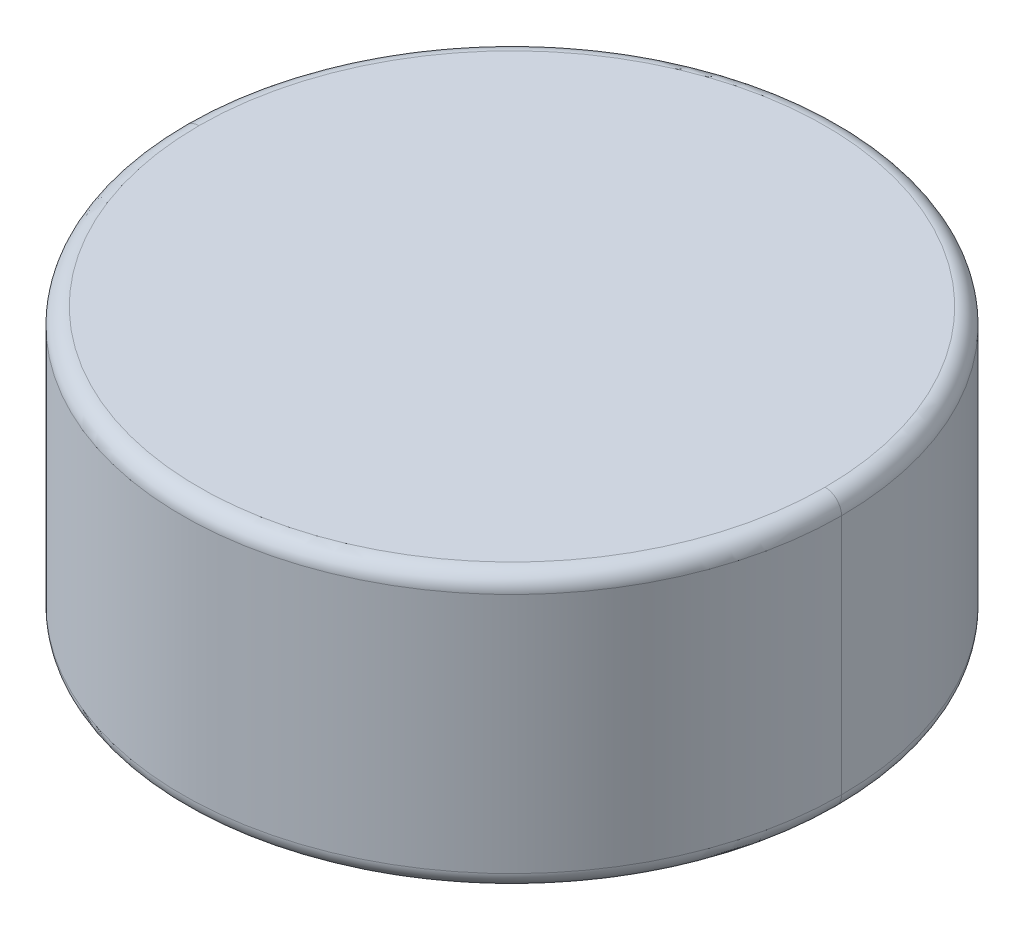
ISO-10303-21;
HEADER;
FILE_DESCRIPTION(('STEP AP214'),'2;1');
FILE_NAME('part.step','',(''),(''),'','','');
FILE_SCHEMA(('AUTOMOTIVE_DESIGN { 1 0 10303 214 1 1 1 1 }'));
ENDSEC;
DATA;
#1=APPLICATION_CONTEXT('core data for automotive mechanical design processes');
#2=APPLICATION_PROTOCOL_DEFINITION('international standard','automotive_design',2000,#1);
#3=PRODUCT_CONTEXT('',#1,'mechanical');
#4=PRODUCT('Part','Part','',(#3));
#5=PRODUCT_RELATED_PRODUCT_CATEGORY('part','',(#4));
#6=PRODUCT_DEFINITION_FORMATION('','',#4);
#7=PRODUCT_DEFINITION_CONTEXT('part definition',#1,'design');
#8=PRODUCT_DEFINITION('design','',#6,#7);
#9=PRODUCT_DEFINITION_SHAPE('','',#8);
#10=(LENGTH_UNIT() NAMED_UNIT(*) SI_UNIT(.MILLI.,.METRE.));
#11=(NAMED_UNIT(*) PLANE_ANGLE_UNIT() SI_UNIT($,.RADIAN.));
#12=(NAMED_UNIT(*) SI_UNIT($,.STERADIAN.) SOLID_ANGLE_UNIT());
#13=UNCERTAINTY_MEASURE_WITH_UNIT(LENGTH_MEASURE(1.E-05),#10,'distance_accuracy_value','');
#14=(GEOMETRIC_REPRESENTATION_CONTEXT(3) GLOBAL_UNCERTAINTY_ASSIGNED_CONTEXT((#13)) GLOBAL_UNIT_ASSIGNED_CONTEXT((#10,
#11,#12)) REPRESENTATION_CONTEXT('',''));
#15=CARTESIAN_POINT('',(0.,0.,0.));
#16=DIRECTION('',(0.,0.,1.));
#17=DIRECTION('',(1.,0.,0.));
#18=AXIS2_PLACEMENT_3D('',#15,#16,#17);
#19=CARTESIAN_POINT('',(0.,0.,0.));
#20=DIRECTION('',(0.,1.,0.));
#21=DIRECTION('',(1.,0.,0.));
#22=AXIS2_PLACEMENT_3D('',#19,#20,#21);
#23=CYLINDRICAL_SURFACE('',#22,3.);
#24=DIRECTION('',(0.,1.,0.));
#25=VECTOR('',#24,1.);
#26=CARTESIAN_POINT('',(3.,0.15,0.));
#27=LINE('',#26,#25);
#28=CARTESIAN_POINT('',(3.,0.15,0.));
#29=VERTEX_POINT('',#28);
#30=CARTESIAN_POINT('',(3.,2.35,0.));
#31=VERTEX_POINT('',#30);
#32=EDGE_CURVE('E42',#29,#31,#27,.T.);
#33=ORIENTED_EDGE('',*,*,#32,.F.);
#34=CARTESIAN_POINT('',(0.,0.15,0.));
#35=DIRECTION('',(0.,1.,0.));
#36=DIRECTION('',(0.999063862785748,0.,-0.0432596587552421));
#37=AXIS2_PLACEMENT_3D('',#34,#35,#36);
#38=CIRCLE('',#37,3.);
#39=CARTESIAN_POINT('',(-3.,0.15,7.518152767005E-12));
#40=VERTEX_POINT('',#39);
#41=EDGE_CURVE('E11',#29,#40,#38,.T.);
#42=ORIENTED_EDGE('',*,*,#41,.T.);
#43=DIRECTION('',(0.,1.,0.));
#44=VECTOR('',#43,1.);
#45=CARTESIAN_POINT('',(-3.,0.15,3.759156364451E-12));
#46=LINE('',#45,#44);
#47=CARTESIAN_POINT('',(-3.,2.35,7.517639288857E-12));
#48=VERTEX_POINT('',#47);
#49=EDGE_CURVE('E28',#40,#48,#46,.T.);
#50=ORIENTED_EDGE('',*,*,#49,.T.);
#51=CARTESIAN_POINT('',(0.,2.35,0.));
#52=DIRECTION('',(0.,-1.,0.));
#53=DIRECTION('',(-0.999536064934297,0.,-0.0304574275942799));
#54=AXIS2_PLACEMENT_3D('',#51,#52,#53);
#55=CIRCLE('',#54,3.);
#56=EDGE_CURVE('E115',#48,#31,#55,.T.);
#57=ORIENTED_EDGE('',*,*,#56,.T.);
#58=EDGE_LOOP('',(#33,#42,#50,#57));
#59=FACE_BOUND('',#58,.T.);
#60=ADVANCED_FACE('F17',(#59),#23,.T.);
#61=CARTESIAN_POINT('',(0.,2.35,0.));
#62=DIRECTION('',(0.,1.,0.));
#63=DIRECTION('',(0.999536064934297,0.,0.0304574275942799));
#64=AXIS2_PLACEMENT_3D('',#61,#62,#63);
#65=TOROIDAL_SURFACE('',#64,2.85,0.15);
#66=CARTESIAN_POINT('',(2.85,2.35,0.));
#67=DIRECTION('',(0.,0.,-1.));
#68=DIRECTION('',(0.,1.,0.));
#69=AXIS2_PLACEMENT_3D('',#66,#67,#68);
#70=CIRCLE('',#69,0.15);
#71=CARTESIAN_POINT('',(2.85,2.5,0.));
#72=VERTEX_POINT('',#71);
#73=EDGE_CURVE('E112',#72,#31,#70,.T.);
#74=ORIENTED_EDGE('',*,*,#73,.T.);
#75=ORIENTED_EDGE('',*,*,#56,.F.);
#76=CARTESIAN_POINT('',(-2.85,2.35,0.));
#77=DIRECTION('',(0.,0.,1.));
#78=DIRECTION('',(0.,1.,0.));
#79=AXIS2_PLACEMENT_3D('',#76,#77,#78);
#80=CIRCLE('',#79,0.15);
#81=CARTESIAN_POINT('',(-2.85,2.5,0.));
#82=VERTEX_POINT('',#81);
#83=EDGE_CURVE('E61',#82,#48,#80,.T.);
#84=ORIENTED_EDGE('',*,*,#83,.F.);
#85=CARTESIAN_POINT('',(0.,2.5,0.));
#86=DIRECTION('',(0.,-1.,0.));
#87=DIRECTION('',(-0.999536064934297,0.,-0.0304574275942799));
#88=AXIS2_PLACEMENT_3D('',#85,#86,#87);
#89=CIRCLE('',#88,2.85);
#90=EDGE_CURVE('E69',#82,#72,#89,.T.);
#91=ORIENTED_EDGE('',*,*,#90,.T.);
#92=EDGE_LOOP('',(#74,#75,#84,#91));
#93=FACE_BOUND('',#92,.T.);
#94=ADVANCED_FACE('F135',(#93),#65,.T.);
#95=CARTESIAN_POINT('',(0.,2.5,0.));
#96=DIRECTION('',(0.,1.,0.));
#97=DIRECTION('',(1.,0.,0.));
#98=AXIS2_PLACEMENT_3D('',#95,#96,#97);
#99=PLANE('',#98);
#100=ORIENTED_EDGE('',*,*,#90,.F.);
#101=CARTESIAN_POINT('',(0.,2.5,0.));
#102=DIRECTION('',(0.,-1.,0.));
#103=DIRECTION('',(1.,0.,0.));
#104=AXIS2_PLACEMENT_3D('',#101,#102,#103);
#105=CIRCLE('',#104,2.85);
#106=EDGE_CURVE('E111',#72,#82,#105,.T.);
#107=ORIENTED_EDGE('',*,*,#106,.F.);
#108=EDGE_LOOP('',(#100,#107));
#109=FACE_BOUND('',#108,.T.);
#110=ADVANCED_FACE('F137',(#109),#99,.T.);
#111=CARTESIAN_POINT('',(0.,2.35,0.));
#112=DIRECTION('',(0.,1.,0.));
#113=DIRECTION('',(-0.999536064934297,0.,-0.0304574275942799));
#114=AXIS2_PLACEMENT_3D('',#111,#112,#113);
#115=TOROIDAL_SURFACE('',#114,2.85,0.15);
#116=ORIENTED_EDGE('',*,*,#83,.T.);
#117=CARTESIAN_POINT('',(0.,2.35,0.));
#118=DIRECTION('',(0.,-1.,0.));
#119=DIRECTION('',(1.,0.,0.));
#120=AXIS2_PLACEMENT_3D('',#117,#118,#119);
#121=CIRCLE('',#120,3.);
#122=EDGE_CURVE('E99',#31,#48,#121,.T.);
#123=ORIENTED_EDGE('',*,*,#122,.F.);
#124=ORIENTED_EDGE('',*,*,#73,.F.);
#125=ORIENTED_EDGE('',*,*,#106,.T.);
#126=EDGE_LOOP('',(#116,#123,#124,#125));
#127=FACE_BOUND('',#126,.T.);
#128=ADVANCED_FACE('F129',(#127),#115,.T.);
#129=CARTESIAN_POINT('',(0.,0.,0.));
#130=DIRECTION('',(0.,1.,0.));
#131=DIRECTION('',(1.,0.,0.));
#132=AXIS2_PLACEMENT_3D('',#129,#130,#131);
#133=CYLINDRICAL_SURFACE('',#132,3.);
#134=ORIENTED_EDGE('',*,*,#49,.F.);
#135=CARTESIAN_POINT('',(0.,0.15,0.));
#136=DIRECTION('',(0.,1.,0.));
#137=DIRECTION('',(-0.999063862785748,0.,0.0432596587552421));
#138=AXIS2_PLACEMENT_3D('',#135,#136,#137);
#139=CIRCLE('',#138,3.);
#140=EDGE_CURVE('E109',#40,#29,#139,.T.);
#141=ORIENTED_EDGE('',*,*,#140,.T.);
#142=ORIENTED_EDGE('',*,*,#32,.T.);
#143=ORIENTED_EDGE('',*,*,#122,.T.);
#144=EDGE_LOOP('',(#134,#141,#142,#143));
#145=FACE_BOUND('',#144,.T.);
#146=ADVANCED_FACE('F133',(#145),#133,.T.);
#147=CARTESIAN_POINT('',(0.,0.15,0.));
#148=DIRECTION('',(0.,1.,0.));
#149=DIRECTION('',(0.999063862785748,0.,-0.0432596587552421));
#150=AXIS2_PLACEMENT_3D('',#147,#148,#149);
#151=TOROIDAL_SURFACE('',#150,2.85,0.15);
#152=CARTESIAN_POINT('',(2.85,0.15,0.));
#153=DIRECTION('',(0.,0.,1.));
#154=DIRECTION('',(0.,-1.,0.));
#155=AXIS2_PLACEMENT_3D('',#152,#153,#154);
#156=CIRCLE('',#155,0.15);
#157=CARTESIAN_POINT('',(2.85,0.,0.));
#158=VERTEX_POINT('',#157);
#159=EDGE_CURVE('E88',#158,#29,#156,.T.);
#160=ORIENTED_EDGE('',*,*,#159,.T.);
#161=ORIENTED_EDGE('',*,*,#140,.F.);
#162=CARTESIAN_POINT('',(-2.85,0.15,0.));
#163=DIRECTION('',(0.,0.,-1.));
#164=DIRECTION('',(0.,-1.,0.));
#165=AXIS2_PLACEMENT_3D('',#162,#163,#164);
#166=CIRCLE('',#165,0.15);
#167=CARTESIAN_POINT('',(-2.85,0.,0.));
#168=VERTEX_POINT('',#167);
#169=EDGE_CURVE('E21',#168,#40,#166,.T.);
#170=ORIENTED_EDGE('',*,*,#169,.F.);
#171=CARTESIAN_POINT('',(0.,0.,0.));
#172=DIRECTION('',(0.,1.,0.));
#173=DIRECTION('',(-0.999063862785748,0.,0.0432596587552422));
#174=AXIS2_PLACEMENT_3D('',#171,#172,#173);
#175=CIRCLE('',#174,2.85);
#176=EDGE_CURVE('E85',#168,#158,#175,.T.);
#177=ORIENTED_EDGE('',*,*,#176,.T.);
#178=EDGE_LOOP('',(#160,#161,#170,#177));
#179=FACE_BOUND('',#178,.T.);
#180=ADVANCED_FACE('F87',(#179),#151,.T.);
#181=CARTESIAN_POINT('',(0.,0.15,0.));
#182=DIRECTION('',(0.,1.,0.));
#183=DIRECTION('',(-0.999063862785748,0.,0.0432596587552421));
#184=AXIS2_PLACEMENT_3D('',#181,#182,#183);
#185=TOROIDAL_SURFACE('',#184,2.85,0.15);
#186=ORIENTED_EDGE('',*,*,#169,.T.);
#187=ORIENTED_EDGE('',*,*,#41,.F.);
#188=ORIENTED_EDGE('',*,*,#159,.F.);
#189=CARTESIAN_POINT('',(0.,0.,0.));
#190=DIRECTION('',(0.,1.,0.));
#191=DIRECTION('',(0.999063862785748,0.,-0.0432596587552422));
#192=AXIS2_PLACEMENT_3D('',#189,#190,#191);
#193=CIRCLE('',#192,2.85);
#194=EDGE_CURVE('E97',#158,#168,#193,.T.);
#195=ORIENTED_EDGE('',*,*,#194,.T.);
#196=EDGE_LOOP('',(#186,#187,#188,#195));
#197=FACE_BOUND('',#196,.T.);
#198=ADVANCED_FACE('F96',(#197),#185,.T.);
#199=CARTESIAN_POINT('',(0.,0.,0.));
#200=DIRECTION('',(0.,1.,0.));
#201=DIRECTION('',(1.,0.,0.));
#202=AXIS2_PLACEMENT_3D('',#199,#200,#201);
#203=PLANE('',#202);
#204=ORIENTED_EDGE('',*,*,#176,.F.);
#205=ORIENTED_EDGE('',*,*,#194,.F.);
#206=EDGE_LOOP('',(#204,#205));
#207=FACE_BOUND('',#206,.T.);
#208=ADVANCED_FACE('F19',(#207),#203,.F.);
#209=CLOSED_SHELL('',(#60,#94,#110,#128,#146,#180,#198,#208));
#210=MANIFOLD_SOLID_BREP('B1',#209);
#211=ADVANCED_BREP_SHAPE_REPRESENTATION('',(#18,#210),#14);
#212=SHAPE_DEFINITION_REPRESENTATION(#9,#211);
ENDSEC;
END-ISO-10303-21;
